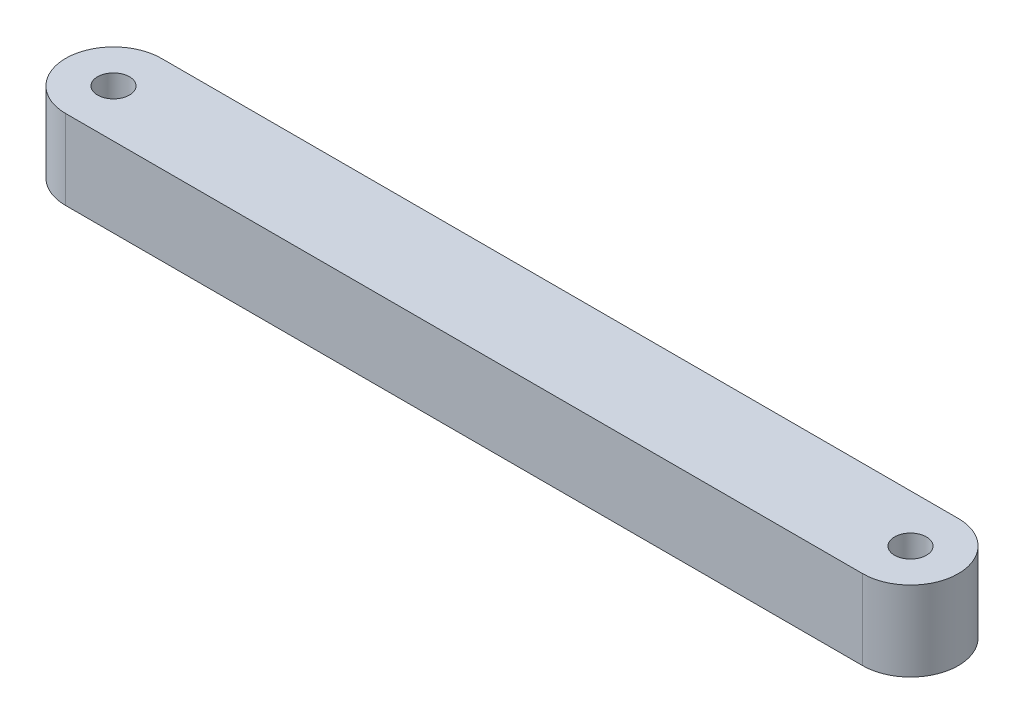
ISO-10303-21;
HEADER;
FILE_DESCRIPTION(('STEP AP214'),'2;1');
FILE_NAME('part.step','',(''),(''),'','','');
FILE_SCHEMA(('AUTOMOTIVE_DESIGN { 1 0 10303 214 1 1 1 1 }'));
ENDSEC;
DATA;
#1=APPLICATION_CONTEXT('core data for automotive mechanical design processes');
#2=APPLICATION_PROTOCOL_DEFINITION('international standard','automotive_design',2000,#1);
#3=PRODUCT_CONTEXT('',#1,'mechanical');
#4=PRODUCT('Part','Part','',(#3));
#5=PRODUCT_RELATED_PRODUCT_CATEGORY('part','',(#4));
#6=PRODUCT_DEFINITION_FORMATION('','',#4);
#7=PRODUCT_DEFINITION_CONTEXT('part definition',#1,'design');
#8=PRODUCT_DEFINITION('design','',#6,#7);
#9=PRODUCT_DEFINITION_SHAPE('','',#8);
#10=(LENGTH_UNIT() NAMED_UNIT(*) SI_UNIT(.MILLI.,.METRE.));
#11=(NAMED_UNIT(*) PLANE_ANGLE_UNIT() SI_UNIT($,.RADIAN.));
#12=(NAMED_UNIT(*) SI_UNIT($,.STERADIAN.) SOLID_ANGLE_UNIT());
#13=UNCERTAINTY_MEASURE_WITH_UNIT(LENGTH_MEASURE(1.E-05),#10,'distance_accuracy_value','');
#14=(GEOMETRIC_REPRESENTATION_CONTEXT(3) GLOBAL_UNCERTAINTY_ASSIGNED_CONTEXT((#13)) GLOBAL_UNIT_ASSIGNED_CONTEXT((#10,
#11,#12)) REPRESENTATION_CONTEXT('',''));
#15=CARTESIAN_POINT('',(0.,0.,0.));
#16=DIRECTION('',(0.,0.,1.));
#17=DIRECTION('',(1.,0.,0.));
#18=AXIS2_PLACEMENT_3D('',#15,#16,#17);
#19=CARTESIAN_POINT('',(-63.5,12.7,0.));
#20=DIRECTION('',(0.,-1.,0.));
#21=DIRECTION('',(0.,0.,-1.));
#22=AXIS2_PLACEMENT_3D('',#19,#20,#21);
#23=CYLINDRICAL_SURFACE('',#22,7.62);
#24=CARTESIAN_POINT('',(-63.5,0.,0.));
#25=DIRECTION('',(0.,1.,0.));
#26=DIRECTION('',(0.,0.,1.));
#27=AXIS2_PLACEMENT_3D('',#24,#25,#26);
#28=CIRCLE('',#27,7.62);
#29=CARTESIAN_POINT('',(-63.5,0.,-7.62));
#30=VERTEX_POINT('',#29);
#31=CARTESIAN_POINT('',(-63.5,0.,7.62));
#32=VERTEX_POINT('',#31);
#33=EDGE_CURVE('E102',#30,#32,#28,.T.);
#34=ORIENTED_EDGE('',*,*,#33,.T.);
#35=DIRECTION('',(0.,-1.,0.));
#36=VECTOR('',#35,1.);
#37=CARTESIAN_POINT('',(-63.5,12.7,7.62));
#38=LINE('',#37,#36);
#39=CARTESIAN_POINT('',(-63.5,12.7,7.62));
#40=VERTEX_POINT('',#39);
#41=EDGE_CURVE('E11',#40,#32,#38,.T.);
#42=ORIENTED_EDGE('',*,*,#41,.F.);
#43=CARTESIAN_POINT('',(-63.5,12.7,0.));
#44=DIRECTION('',(0.,1.,0.));
#45=DIRECTION('',(0.,0.,1.));
#46=AXIS2_PLACEMENT_3D('',#43,#44,#45);
#47=CIRCLE('',#46,7.62);
#48=CARTESIAN_POINT('',(-63.5,12.7,-7.62));
#49=VERTEX_POINT('',#48);
#50=EDGE_CURVE('E90',#49,#40,#47,.T.);
#51=ORIENTED_EDGE('',*,*,#50,.F.);
#52=DIRECTION('',(0.,-1.,0.));
#53=VECTOR('',#52,1.);
#54=CARTESIAN_POINT('',(-63.5,12.7,-7.62));
#55=LINE('',#54,#53);
#56=EDGE_CURVE('E98',#49,#30,#55,.T.);
#57=ORIENTED_EDGE('',*,*,#56,.T.);
#58=EDGE_LOOP('',(#34,#42,#51,#57));
#59=FACE_BOUND('',#58,.T.);
#60=ADVANCED_FACE('F39',(#59),#23,.T.);
#61=CARTESIAN_POINT('',(-63.5,12.7,7.62));
#62=DIRECTION('',(0.,0.,-1.));
#63=DIRECTION('',(-1.,0.,0.));
#64=AXIS2_PLACEMENT_3D('',#61,#62,#63);
#65=PLANE('',#64);
#66=DIRECTION('',(1.,0.,0.));
#67=VECTOR('',#66,1.);
#68=CARTESIAN_POINT('',(-63.5,0.,7.62));
#69=LINE('',#68,#67);
#70=CARTESIAN_POINT('',(63.5,0.,7.62));
#71=VERTEX_POINT('',#70);
#72=EDGE_CURVE('E94',#32,#71,#69,.T.);
#73=ORIENTED_EDGE('',*,*,#72,.T.);
#74=DIRECTION('',(0.,-1.,0.));
#75=VECTOR('',#74,1.);
#76=CARTESIAN_POINT('',(63.5,12.7,7.62));
#77=LINE('',#76,#75);
#78=CARTESIAN_POINT('',(63.5,12.7,7.62));
#79=VERTEX_POINT('',#78);
#80=EDGE_CURVE('E47',#79,#71,#77,.T.);
#81=ORIENTED_EDGE('',*,*,#80,.F.);
#82=DIRECTION('',(1.,0.,0.));
#83=VECTOR('',#82,1.);
#84=CARTESIAN_POINT('',(-63.5,12.7,7.62));
#85=LINE('',#84,#83);
#86=EDGE_CURVE('E85',#40,#79,#85,.T.);
#87=ORIENTED_EDGE('',*,*,#86,.F.);
#88=ORIENTED_EDGE('',*,*,#41,.T.);
#89=EDGE_LOOP('',(#73,#81,#87,#88));
#90=FACE_BOUND('',#89,.T.);
#91=ADVANCED_FACE('F93',(#90),#65,.F.);
#92=CARTESIAN_POINT('',(63.5,12.7,0.));
#93=DIRECTION('',(0.,-1.,0.));
#94=DIRECTION('',(0.,0.,-1.));
#95=AXIS2_PLACEMENT_3D('',#92,#93,#94);
#96=CYLINDRICAL_SURFACE('',#95,7.62);
#97=CARTESIAN_POINT('',(63.5,0.,0.));
#98=DIRECTION('',(0.,1.,0.));
#99=DIRECTION('',(0.,0.,1.));
#100=AXIS2_PLACEMENT_3D('',#97,#98,#99);
#101=CIRCLE('',#100,7.62);
#102=CARTESIAN_POINT('',(63.5,0.,-7.62));
#103=VERTEX_POINT('',#102);
#104=EDGE_CURVE('E72',#71,#103,#101,.T.);
#105=ORIENTED_EDGE('',*,*,#104,.T.);
#106=DIRECTION('',(0.,-1.,0.));
#107=VECTOR('',#106,1.);
#108=CARTESIAN_POINT('',(63.5,12.7,-7.62));
#109=LINE('',#108,#107);
#110=CARTESIAN_POINT('',(63.5,12.7,-7.62));
#111=VERTEX_POINT('',#110);
#112=EDGE_CURVE('E95',#111,#103,#109,.T.);
#113=ORIENTED_EDGE('',*,*,#112,.F.);
#114=CARTESIAN_POINT('',(63.5,12.7,0.));
#115=DIRECTION('',(0.,1.,0.));
#116=DIRECTION('',(0.,0.,1.));
#117=AXIS2_PLACEMENT_3D('',#114,#115,#116);
#118=CIRCLE('',#117,7.62);
#119=EDGE_CURVE('E88',#79,#111,#118,.T.);
#120=ORIENTED_EDGE('',*,*,#119,.F.);
#121=ORIENTED_EDGE('',*,*,#80,.T.);
#122=EDGE_LOOP('',(#105,#113,#120,#121));
#123=FACE_BOUND('',#122,.T.);
#124=ADVANCED_FACE('F96',(#123),#96,.T.);
#125=CARTESIAN_POINT('',(-63.5,12.7,-7.62));
#126=DIRECTION('',(0.,0.,1.));
#127=DIRECTION('',(1.,0.,0.));
#128=AXIS2_PLACEMENT_3D('',#125,#126,#127);
#129=PLANE('',#128);
#130=DIRECTION('',(-1.,0.,0.));
#131=VECTOR('',#130,1.);
#132=CARTESIAN_POINT('',(-63.5,0.,-7.62));
#133=LINE('',#132,#131);
#134=EDGE_CURVE('E78',#103,#30,#133,.T.);
#135=ORIENTED_EDGE('',*,*,#134,.T.);
#136=ORIENTED_EDGE('',*,*,#56,.F.);
#137=DIRECTION('',(-1.,0.,0.));
#138=VECTOR('',#137,1.);
#139=CARTESIAN_POINT('',(-63.5,12.7,-7.62));
#140=LINE('',#139,#138);
#141=EDGE_CURVE('E55',#111,#49,#140,.T.);
#142=ORIENTED_EDGE('',*,*,#141,.F.);
#143=ORIENTED_EDGE('',*,*,#112,.T.);
#144=EDGE_LOOP('',(#135,#136,#142,#143));
#145=FACE_BOUND('',#144,.T.);
#146=ADVANCED_FACE('F110',(#145),#129,.F.);
#147=CARTESIAN_POINT('',(-63.5,12.7,0.));
#148=DIRECTION('',(0.,1.,0.));
#149=DIRECTION('',(0.,0.,1.));
#150=AXIS2_PLACEMENT_3D('',#147,#148,#149);
#151=PLANE('',#150);
#152=CARTESIAN_POINT('',(-63.5,12.7,0.));
#153=DIRECTION('',(0.,1.,0.));
#154=DIRECTION('',(0.,0.,1.));
#155=AXIS2_PLACEMENT_3D('',#152,#153,#154);
#156=CIRCLE('',#155,2.54);
#157=CARTESIAN_POINT('',(-63.5,12.7,2.54));
#158=VERTEX_POINT('',#157);
#159=EDGE_CURVE('E122',#158,#158,#156,.T.);
#160=ORIENTED_EDGE('',*,*,#159,.F.);
#161=EDGE_LOOP('',(#160));
#162=FACE_BOUND('',#161,.T.);
#163=CARTESIAN_POINT('',(63.5,12.7,0.));
#164=DIRECTION('',(0.,1.,0.));
#165=DIRECTION('',(0.,0.,-1.));
#166=AXIS2_PLACEMENT_3D('',#163,#164,#165);
#167=CIRCLE('',#166,2.54);
#168=CARTESIAN_POINT('',(63.5,12.7,-2.54));
#169=VERTEX_POINT('',#168);
#170=EDGE_CURVE('E119',#169,#169,#167,.T.);
#171=ORIENTED_EDGE('',*,*,#170,.F.);
#172=EDGE_LOOP('',(#171));
#173=FACE_BOUND('',#172,.T.);
#174=ORIENTED_EDGE('',*,*,#50,.T.);
#175=ORIENTED_EDGE('',*,*,#86,.T.);
#176=ORIENTED_EDGE('',*,*,#119,.T.);
#177=ORIENTED_EDGE('',*,*,#141,.T.);
#178=EDGE_LOOP('',(#174,#175,#176,#177));
#179=FACE_BOUND('',#178,.T.);
#180=ADVANCED_FACE('F86',(#162,#173,#179),#151,.T.);
#181=CARTESIAN_POINT('',(-63.5,0.,0.));
#182=DIRECTION('',(0.,1.,0.));
#183=DIRECTION('',(0.,0.,1.));
#184=AXIS2_PLACEMENT_3D('',#181,#182,#183);
#185=PLANE('',#184);
#186=CARTESIAN_POINT('',(-63.5,0.,0.));
#187=DIRECTION('',(0.,1.,0.));
#188=DIRECTION('',(0.,0.,1.));
#189=AXIS2_PLACEMENT_3D('',#186,#187,#188);
#190=CIRCLE('',#189,2.54);
#191=CARTESIAN_POINT('',(-63.5,0.,2.54));
#192=VERTEX_POINT('',#191);
#193=EDGE_CURVE('E105',#192,#192,#190,.T.);
#194=ORIENTED_EDGE('',*,*,#193,.T.);
#195=EDGE_LOOP('',(#194));
#196=FACE_BOUND('',#195,.T.);
#197=CARTESIAN_POINT('',(63.5,0.,0.));
#198=DIRECTION('',(0.,1.,0.));
#199=DIRECTION('',(0.,0.,-1.));
#200=AXIS2_PLACEMENT_3D('',#197,#198,#199);
#201=CIRCLE('',#200,2.54);
#202=CARTESIAN_POINT('',(63.5,0.,-2.54));
#203=VERTEX_POINT('',#202);
#204=EDGE_CURVE('E116',#203,#203,#201,.T.);
#205=ORIENTED_EDGE('',*,*,#204,.T.);
#206=EDGE_LOOP('',(#205));
#207=FACE_BOUND('',#206,.T.);
#208=ORIENTED_EDGE('',*,*,#33,.F.);
#209=ORIENTED_EDGE('',*,*,#134,.F.);
#210=ORIENTED_EDGE('',*,*,#104,.F.);
#211=ORIENTED_EDGE('',*,*,#72,.F.);
#212=EDGE_LOOP('',(#208,#209,#210,#211));
#213=FACE_BOUND('',#212,.T.);
#214=ADVANCED_FACE('F113',(#196,#207,#213),#185,.F.);
#215=CARTESIAN_POINT('',(63.5,0.,0.));
#216=DIRECTION('',(0.,1.,0.));
#217=DIRECTION('',(0.,0.,1.));
#218=AXIS2_PLACEMENT_3D('',#215,#216,#217);
#219=CYLINDRICAL_SURFACE('',#218,2.54);
#220=ORIENTED_EDGE('',*,*,#204,.F.);
#221=EDGE_LOOP('',(#220));
#222=FACE_BOUND('',#221,.T.);
#223=ORIENTED_EDGE('',*,*,#170,.T.);
#224=EDGE_LOOP('',(#223));
#225=FACE_BOUND('',#224,.T.);
#226=ADVANCED_FACE('F133',(#222,#225),#219,.F.);
#227=CARTESIAN_POINT('',(-63.5,0.,0.));
#228=DIRECTION('',(0.,1.,0.));
#229=DIRECTION('',(0.,0.,1.));
#230=AXIS2_PLACEMENT_3D('',#227,#228,#229);
#231=CYLINDRICAL_SURFACE('',#230,2.54);
#232=ORIENTED_EDGE('',*,*,#193,.F.);
#233=EDGE_LOOP('',(#232));
#234=FACE_BOUND('',#233,.T.);
#235=ORIENTED_EDGE('',*,*,#159,.T.);
#236=EDGE_LOOP('',(#235));
#237=FACE_BOUND('',#236,.T.);
#238=ADVANCED_FACE('F130',(#234,#237),#231,.F.);
#239=CLOSED_SHELL('',(#60,#91,#124,#146,#180,#214,#226,#238));
#240=MANIFOLD_SOLID_BREP('B2',#239);
#241=ADVANCED_BREP_SHAPE_REPRESENTATION('',(#18,#240),#14);
#242=SHAPE_DEFINITION_REPRESENTATION(#9,#241);
ENDSEC;
END-ISO-10303-21;
